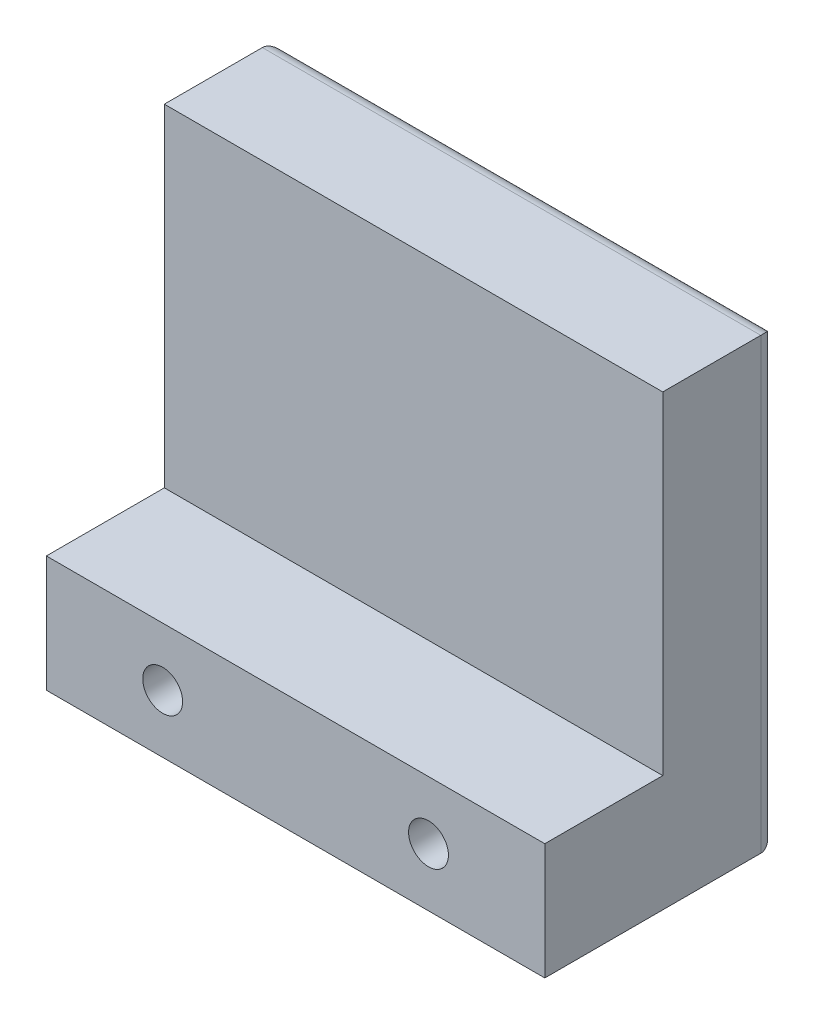
ISO-10303-21;
HEADER;
FILE_DESCRIPTION(('STEP AP214'),'2;1');
FILE_NAME('part.step','',(''),(''),'','','');
FILE_SCHEMA(('AUTOMOTIVE_DESIGN { 1 0 10303 214 1 1 1 1 }'));
ENDSEC;
DATA;
#1=APPLICATION_CONTEXT('core data for automotive mechanical design processes');
#2=APPLICATION_PROTOCOL_DEFINITION('international standard','automotive_design',2000,#1);
#3=PRODUCT_CONTEXT('',#1,'mechanical');
#4=PRODUCT('Part','Part','',(#3));
#5=PRODUCT_RELATED_PRODUCT_CATEGORY('part','',(#4));
#6=PRODUCT_DEFINITION_FORMATION('','',#4);
#7=PRODUCT_DEFINITION_CONTEXT('part definition',#1,'design');
#8=PRODUCT_DEFINITION('design','',#6,#7);
#9=PRODUCT_DEFINITION_SHAPE('','',#8);
#10=(LENGTH_UNIT() NAMED_UNIT(*) SI_UNIT(.MILLI.,.METRE.));
#11=(NAMED_UNIT(*) PLANE_ANGLE_UNIT() SI_UNIT($,.RADIAN.));
#12=(NAMED_UNIT(*) SI_UNIT($,.STERADIAN.) SOLID_ANGLE_UNIT());
#13=UNCERTAINTY_MEASURE_WITH_UNIT(LENGTH_MEASURE(1.E-05),#10,'distance_accuracy_value','');
#14=(GEOMETRIC_REPRESENTATION_CONTEXT(3) GLOBAL_UNCERTAINTY_ASSIGNED_CONTEXT((#13)) GLOBAL_UNIT_ASSIGNED_CONTEXT((#10,
#11,#12)) REPRESENTATION_CONTEXT('',''));
#15=CARTESIAN_POINT('',(0.,0.,0.));
#16=DIRECTION('',(0.,0.,1.));
#17=DIRECTION('',(1.,0.,0.));
#18=AXIS2_PLACEMENT_3D('',#15,#16,#17);
#19=CARTESIAN_POINT('',(-19.05,8.89,8.89));
#20=DIRECTION('',(1.,0.,0.));
#21=DIRECTION('',(0.,0.,-1.));
#22=AXIS2_PLACEMENT_3D('',#19,#20,#21);
#23=PLANE('',#22);
#24=DIRECTION('',(0.,0.,1.));
#25=VECTOR('',#24,1.);
#26=CARTESIAN_POINT('',(-19.05,34.29,-8.89));
#27=LINE('',#26,#25);
#28=CARTESIAN_POINT('',(-19.05,34.29,-7.61999999999999));
#29=VERTEX_POINT('',#28);
#30=CARTESIAN_POINT('',(-19.05,34.29,-0.126999999999997));
#31=VERTEX_POINT('',#30);
#32=EDGE_CURVE('E96',#29,#31,#27,.T.);
#33=ORIENTED_EDGE('',*,*,#32,.F.);
#34=DIRECTION('',(0.,-1.,0.));
#35=VECTOR('',#34,1.);
#36=CARTESIAN_POINT('',(-19.05,8.89,-7.61999999999999));
#37=LINE('',#36,#35);
#38=CARTESIAN_POINT('',(-19.05,0.,-7.61999999999999));
#39=VERTEX_POINT('',#38);
#40=EDGE_CURVE('E151',#29,#39,#37,.T.);
#41=ORIENTED_EDGE('',*,*,#40,.T.);
#42=DIRECTION('',(0.,0.,1.));
#43=VECTOR('',#42,1.);
#44=CARTESIAN_POINT('',(-19.05,0.,8.89));
#45=LINE('',#44,#43);
#46=CARTESIAN_POINT('',(-19.05,0.,8.89));
#47=VERTEX_POINT('',#46);
#48=EDGE_CURVE('E118',#39,#47,#45,.T.);
#49=ORIENTED_EDGE('',*,*,#48,.T.);
#50=DIRECTION('',(0.,-1.,0.));
#51=VECTOR('',#50,1.);
#52=CARTESIAN_POINT('',(-19.05,8.89,8.89));
#53=LINE('',#52,#51);
#54=CARTESIAN_POINT('',(-19.05,8.89,8.89));
#55=VERTEX_POINT('',#54);
#56=EDGE_CURVE('E136',#55,#47,#53,.T.);
#57=ORIENTED_EDGE('',*,*,#56,.F.);
#58=DIRECTION('',(0.,0.,1.));
#59=VECTOR('',#58,1.);
#60=CARTESIAN_POINT('',(-19.05,8.89,8.89));
#61=LINE('',#60,#59);
#62=CARTESIAN_POINT('',(-19.05,8.89,-0.126999999999997));
#63=VERTEX_POINT('',#62);
#64=EDGE_CURVE('E117',#63,#55,#61,.T.);
#65=ORIENTED_EDGE('',*,*,#64,.F.);
#66=DIRECTION('',(0.,-1.,0.));
#67=VECTOR('',#66,1.);
#68=CARTESIAN_POINT('',(-19.05,34.29,-0.126999999999997));
#69=LINE('',#68,#67);
#70=EDGE_CURVE('E110',#31,#63,#69,.T.);
#71=ORIENTED_EDGE('',*,*,#70,.F.);
#72=EDGE_LOOP('',(#33,#41,#49,#57,#65,#71));
#73=FACE_BOUND('',#72,.T.);
#74=ADVANCED_FACE('F33',(#73),#23,.F.);
#75=CARTESIAN_POINT('',(19.05,8.89,8.89));
#76=DIRECTION('',(0.,0.,-1.));
#77=DIRECTION('',(-1.,0.,0.));
#78=AXIS2_PLACEMENT_3D('',#75,#76,#77);
#79=PLANE('',#78);
#80=CARTESIAN_POINT('',(-10.16,4.445,8.89));
#81=DIRECTION('',(0.,0.,1.));
#82=DIRECTION('',(1.,0.,0.));
#83=AXIS2_PLACEMENT_3D('',#80,#81,#82);
#84=CIRCLE('',#83,1.524);
#85=CARTESIAN_POINT('',(-8.636,4.445,8.89));
#86=VERTEX_POINT('',#85);
#87=EDGE_CURVE('E173',#86,#86,#84,.T.);
#88=ORIENTED_EDGE('',*,*,#87,.F.);
#89=EDGE_LOOP('',(#88));
#90=FACE_BOUND('',#89,.T.);
#91=CARTESIAN_POINT('',(10.16,4.445,8.89));
#92=DIRECTION('',(0.,0.,1.));
#93=DIRECTION('',(1.,0.,0.));
#94=AXIS2_PLACEMENT_3D('',#91,#92,#93);
#95=CIRCLE('',#94,1.524);
#96=CARTESIAN_POINT('',(11.684,4.445,8.89));
#97=VERTEX_POINT('',#96);
#98=EDGE_CURVE('E163',#97,#97,#95,.T.);
#99=ORIENTED_EDGE('',*,*,#98,.F.);
#100=EDGE_LOOP('',(#99));
#101=FACE_BOUND('',#100,.T.);
#102=DIRECTION('',(1.,0.,0.));
#103=VECTOR('',#102,1.);
#104=CARTESIAN_POINT('',(19.05,0.,8.89));
#105=LINE('',#104,#103);
#106=CARTESIAN_POINT('',(19.05,0.,8.89));
#107=VERTEX_POINT('',#106);
#108=EDGE_CURVE('E120',#47,#107,#105,.T.);
#109=ORIENTED_EDGE('',*,*,#108,.T.);
#110=DIRECTION('',(0.,-1.,0.));
#111=VECTOR('',#110,1.);
#112=CARTESIAN_POINT('',(19.05,8.89,8.89));
#113=LINE('',#112,#111);
#114=CARTESIAN_POINT('',(19.05,8.89,8.89));
#115=VERTEX_POINT('',#114);
#116=EDGE_CURVE('E130',#115,#107,#113,.T.);
#117=ORIENTED_EDGE('',*,*,#116,.F.);
#118=DIRECTION('',(1.,0.,0.));
#119=VECTOR('',#118,1.);
#120=CARTESIAN_POINT('',(19.05,8.89,8.89));
#121=LINE('',#120,#119);
#122=EDGE_CURVE('E126',#55,#115,#121,.T.);
#123=ORIENTED_EDGE('',*,*,#122,.F.);
#124=ORIENTED_EDGE('',*,*,#56,.T.);
#125=EDGE_LOOP('',(#109,#117,#123,#124));
#126=FACE_BOUND('',#125,.T.);
#127=ADVANCED_FACE('F187',(#90,#101,#126),#79,.F.);
#128=CARTESIAN_POINT('',(19.05,8.89,8.89));
#129=DIRECTION('',(-1.,0.,0.));
#130=DIRECTION('',(0.,0.,1.));
#131=AXIS2_PLACEMENT_3D('',#128,#129,#130);
#132=PLANE('',#131);
#133=DIRECTION('',(0.,0.,-1.));
#134=VECTOR('',#133,1.);
#135=CARTESIAN_POINT('',(19.05,0.,8.89));
#136=LINE('',#135,#134);
#137=CARTESIAN_POINT('',(19.05,0.,-7.62));
#138=VERTEX_POINT('',#137);
#139=EDGE_CURVE('E127',#107,#138,#136,.T.);
#140=ORIENTED_EDGE('',*,*,#139,.T.);
#141=DIRECTION('',(0.,-1.,0.));
#142=VECTOR('',#141,1.);
#143=CARTESIAN_POINT('',(19.05,8.89,-7.62));
#144=LINE('',#143,#142);
#145=CARTESIAN_POINT('',(19.05,34.29,-7.62));
#146=VERTEX_POINT('',#145);
#147=EDGE_CURVE('E11',#138,#146,#144,.F.);
#148=ORIENTED_EDGE('',*,*,#147,.T.);
#149=DIRECTION('',(0.,0.,-1.));
#150=VECTOR('',#149,1.);
#151=CARTESIAN_POINT('',(19.05,34.29,-8.89));
#152=LINE('',#151,#150);
#153=CARTESIAN_POINT('',(19.05,34.29,-0.126999999999997));
#154=VERTEX_POINT('',#153);
#155=EDGE_CURVE('E113',#154,#146,#152,.T.);
#156=ORIENTED_EDGE('',*,*,#155,.F.);
#157=DIRECTION('',(0.,-1.,0.));
#158=VECTOR('',#157,1.);
#159=CARTESIAN_POINT('',(19.05,34.29,-0.126999999999997));
#160=LINE('',#159,#158);
#161=CARTESIAN_POINT('',(19.05,8.89,-0.126999999999997));
#162=VERTEX_POINT('',#161);
#163=EDGE_CURVE('E112',#154,#162,#160,.T.);
#164=ORIENTED_EDGE('',*,*,#163,.T.);
#165=DIRECTION('',(0.,0.,-1.));
#166=VECTOR('',#165,1.);
#167=CARTESIAN_POINT('',(19.05,8.89,8.89));
#168=LINE('',#167,#166);
#169=EDGE_CURVE('E129',#115,#162,#168,.T.);
#170=ORIENTED_EDGE('',*,*,#169,.F.);
#171=ORIENTED_EDGE('',*,*,#116,.T.);
#172=EDGE_LOOP('',(#140,#148,#156,#164,#170,#171));
#173=FACE_BOUND('',#172,.T.);
#174=ADVANCED_FACE('F190',(#173),#132,.F.);
#175=CARTESIAN_POINT('',(19.05,8.89,-8.89));
#176=DIRECTION('',(0.,0.,1.));
#177=DIRECTION('',(1.,0.,0.));
#178=AXIS2_PLACEMENT_3D('',#175,#176,#177);
#179=PLANE('',#178);
#180=DIRECTION('',(0.,-1.,0.));
#181=VECTOR('',#180,1.);
#182=CARTESIAN_POINT('',(17.78,8.89,-8.89));
#183=LINE('',#182,#181);
#184=CARTESIAN_POINT('',(17.78,33.02,-8.89));
#185=VERTEX_POINT('',#184);
#186=CARTESIAN_POINT('',(17.78,1.27,-8.89));
#187=VERTEX_POINT('',#186);
#188=EDGE_CURVE('E139',#185,#187,#183,.T.);
#189=ORIENTED_EDGE('',*,*,#188,.T.);
#190=DIRECTION('',(-1.,0.,0.));
#191=VECTOR('',#190,1.);
#192=CARTESIAN_POINT('',(19.05,1.27,-8.89));
#193=LINE('',#192,#191);
#194=CARTESIAN_POINT('',(-17.78,1.27,-8.89));
#195=VERTEX_POINT('',#194);
#196=EDGE_CURVE('E145',#187,#195,#193,.T.);
#197=ORIENTED_EDGE('',*,*,#196,.T.);
#198=DIRECTION('',(0.,-1.,0.));
#199=VECTOR('',#198,1.);
#200=CARTESIAN_POINT('',(-17.78,8.89,-8.89));
#201=LINE('',#200,#199);
#202=CARTESIAN_POINT('',(-17.78,33.02,-8.89));
#203=VERTEX_POINT('',#202);
#204=EDGE_CURVE('E143',#195,#203,#201,.F.);
#205=ORIENTED_EDGE('',*,*,#204,.T.);
#206=DIRECTION('',(-1.,0.,0.));
#207=VECTOR('',#206,1.);
#208=CARTESIAN_POINT('',(19.05,33.02,-8.89));
#209=LINE('',#208,#207);
#210=EDGE_CURVE('E141',#203,#185,#209,.F.);
#211=ORIENTED_EDGE('',*,*,#210,.T.);
#212=EDGE_LOOP('',(#189,#197,#205,#211));
#213=FACE_BOUND('',#212,.T.);
#214=CARTESIAN_POINT('',(-10.16,4.445,-8.89));
#215=DIRECTION('',(0.,0.,1.));
#216=DIRECTION('',(1.,0.,0.));
#217=AXIS2_PLACEMENT_3D('',#214,#215,#216);
#218=CIRCLE('',#217,1.524);
#219=CARTESIAN_POINT('',(-8.636,4.445,-8.89));
#220=VERTEX_POINT('',#219);
#221=EDGE_CURVE('E177',#220,#220,#218,.T.);
#222=ORIENTED_EDGE('',*,*,#221,.T.);
#223=EDGE_LOOP('',(#222));
#224=FACE_BOUND('',#223,.T.);
#225=CARTESIAN_POINT('',(10.16,4.445,-8.89));
#226=DIRECTION('',(0.,0.,1.));
#227=DIRECTION('',(1.,0.,0.));
#228=AXIS2_PLACEMENT_3D('',#225,#226,#227);
#229=CIRCLE('',#228,1.524);
#230=CARTESIAN_POINT('',(11.684,4.445,-8.89));
#231=VERTEX_POINT('',#230);
#232=EDGE_CURVE('E168',#231,#231,#229,.T.);
#233=ORIENTED_EDGE('',*,*,#232,.T.);
#234=EDGE_LOOP('',(#233));
#235=FACE_BOUND('',#234,.T.);
#236=ADVANCED_FACE('F210',(#213,#224,#235),#179,.F.);
#237=CARTESIAN_POINT('',(0.,8.89,0.));
#238=DIRECTION('',(0.,1.,0.));
#239=DIRECTION('',(0.,0.,1.));
#240=AXIS2_PLACEMENT_3D('',#237,#238,#239);
#241=PLANE('',#240);
#242=DIRECTION('',(1.,0.,0.));
#243=VECTOR('',#242,1.);
#244=CARTESIAN_POINT('',(-19.05,8.89,-0.126999999999997));
#245=LINE('',#244,#243);
#246=EDGE_CURVE('E104',#63,#162,#245,.T.);
#247=ORIENTED_EDGE('',*,*,#246,.F.);
#248=ORIENTED_EDGE('',*,*,#64,.T.);
#249=ORIENTED_EDGE('',*,*,#122,.T.);
#250=ORIENTED_EDGE('',*,*,#169,.T.);
#251=EDGE_LOOP('',(#247,#248,#249,#250));
#252=FACE_BOUND('',#251,.T.);
#253=ADVANCED_FACE('F266',(#252),#241,.T.);
#254=CARTESIAN_POINT('',(0.,0.,0.));
#255=DIRECTION('',(0.,1.,0.));
#256=DIRECTION('',(0.,0.,1.));
#257=AXIS2_PLACEMENT_3D('',#254,#255,#256);
#258=PLANE('',#257);
#259=ORIENTED_EDGE('',*,*,#48,.F.);
#260=DIRECTION('',(-1.,0.,0.));
#261=VECTOR('',#260,1.);
#262=CARTESIAN_POINT('',(0.,0.,-7.62));
#263=LINE('',#262,#261);
#264=EDGE_CURVE('E148',#39,#138,#263,.F.);
#265=ORIENTED_EDGE('',*,*,#264,.T.);
#266=ORIENTED_EDGE('',*,*,#139,.F.);
#267=ORIENTED_EDGE('',*,*,#108,.F.);
#268=EDGE_LOOP('',(#259,#265,#266,#267));
#269=FACE_BOUND('',#268,.T.);
#270=ADVANCED_FACE('F200',(#269),#258,.F.);
#271=CARTESIAN_POINT('',(-19.05,34.29,-0.126999999999997));
#272=DIRECTION('',(0.,0.,-1.));
#273=DIRECTION('',(-1.,0.,0.));
#274=AXIS2_PLACEMENT_3D('',#271,#272,#273);
#275=PLANE('',#274);
#276=ORIENTED_EDGE('',*,*,#246,.T.);
#277=ORIENTED_EDGE('',*,*,#163,.F.);
#278=DIRECTION('',(1.,0.,0.));
#279=VECTOR('',#278,1.);
#280=CARTESIAN_POINT('',(-19.05,34.29,-0.126999999999997));
#281=LINE('',#280,#279);
#282=EDGE_CURVE('E99',#31,#154,#281,.T.);
#283=ORIENTED_EDGE('',*,*,#282,.F.);
#284=ORIENTED_EDGE('',*,*,#70,.T.);
#285=EDGE_LOOP('',(#276,#277,#283,#284));
#286=FACE_BOUND('',#285,.T.);
#287=ADVANCED_FACE('F109',(#286),#275,.F.);
#288=CARTESIAN_POINT('',(0.,34.29,0.));
#289=DIRECTION('',(0.,1.,0.));
#290=DIRECTION('',(0.,0.,1.));
#291=AXIS2_PLACEMENT_3D('',#288,#289,#290);
#292=PLANE('',#291);
#293=ORIENTED_EDGE('',*,*,#155,.T.);
#294=DIRECTION('',(-1.,0.,0.));
#295=VECTOR('',#294,1.);
#296=CARTESIAN_POINT('',(-19.05,34.29,-7.61999999999999));
#297=LINE('',#296,#295);
#298=EDGE_CURVE('E42',#146,#29,#297,.T.);
#299=ORIENTED_EDGE('',*,*,#298,.T.);
#300=ORIENTED_EDGE('',*,*,#32,.T.);
#301=ORIENTED_EDGE('',*,*,#282,.T.);
#302=EDGE_LOOP('',(#293,#299,#300,#301));
#303=FACE_BOUND('',#302,.T.);
#304=ADVANCED_FACE('F98',(#303),#292,.T.);
#305=CARTESIAN_POINT('',(10.16,4.445,-8.89));
#306=DIRECTION('',(0.,0.,1.));
#307=DIRECTION('',(1.,0.,0.));
#308=AXIS2_PLACEMENT_3D('',#305,#306,#307);
#309=CYLINDRICAL_SURFACE('',#308,1.524);
#310=CARTESIAN_POINT('',(11.684,4.445,-8.89));
#311=CARTESIAN_POINT('',(11.684,4.445,-8.70479166666667));
#312=CARTESIAN_POINT('',(11.684,4.445,-8.51958333333334));
#313=CARTESIAN_POINT('',(11.684,4.445,-8.14916666666667));
#314=CARTESIAN_POINT('',(11.684,4.445,-7.96395833333334));
#315=CARTESIAN_POINT('',(11.684,4.445,-7.59354166666667));
#316=CARTESIAN_POINT('',(11.684,4.445,-7.40833333333334));
#317=CARTESIAN_POINT('',(11.684,4.445,-7.03791666666667));
#318=CARTESIAN_POINT('',(11.684,4.445,-6.85270833333334));
#319=CARTESIAN_POINT('',(11.684,4.445,-6.48229166666667));
#320=CARTESIAN_POINT('',(11.684,4.445,-6.29708333333334));
#321=CARTESIAN_POINT('',(11.684,4.445,-5.92666666666667));
#322=CARTESIAN_POINT('',(11.684,4.445,-5.74145833333334));
#323=CARTESIAN_POINT('',(11.684,4.445,-5.37104166666667));
#324=CARTESIAN_POINT('',(11.684,4.445,-5.18583333333334));
#325=CARTESIAN_POINT('',(11.684,4.445,-4.81541666666667));
#326=CARTESIAN_POINT('',(11.684,4.445,-4.63020833333334));
#327=CARTESIAN_POINT('',(11.684,4.445,-4.25979166666667));
#328=CARTESIAN_POINT('',(11.684,4.445,-4.07458333333334));
#329=CARTESIAN_POINT('',(11.684,4.445,-3.70416666666667));
#330=CARTESIAN_POINT('',(11.684,4.445,-3.51895833333334));
#331=CARTESIAN_POINT('',(11.684,4.445,-3.14854166666667));
#332=CARTESIAN_POINT('',(11.684,4.445,-2.96333333333334));
#333=CARTESIAN_POINT('',(11.684,4.445,-2.59291666666667));
#334=CARTESIAN_POINT('',(11.684,4.445,-2.40770833333334));
#335=CARTESIAN_POINT('',(11.684,4.445,-2.03729166666667));
#336=CARTESIAN_POINT('',(11.684,4.445,-1.85208333333334));
#337=CARTESIAN_POINT('',(11.684,4.445,-1.48166666666667));
#338=CARTESIAN_POINT('',(11.684,4.445,-1.29645833333334));
#339=CARTESIAN_POINT('',(11.684,4.445,-0.926041666666669));
#340=CARTESIAN_POINT('',(11.684,4.445,-0.740833333333337));
#341=CARTESIAN_POINT('',(11.684,4.445,-0.370416666666671));
#342=CARTESIAN_POINT('',(11.684,4.445,-0.185208333333337));
#343=CARTESIAN_POINT('',(11.684,4.445,0.18520833333333));
#344=CARTESIAN_POINT('',(11.684,4.445,0.370416666666664));
#345=CARTESIAN_POINT('',(11.684,4.445,0.740833333333331));
#346=CARTESIAN_POINT('',(11.684,4.445,0.926041666666664));
#347=CARTESIAN_POINT('',(11.684,4.445,1.29645833333333));
#348=CARTESIAN_POINT('',(11.684,4.445,1.48166666666666));
#349=CARTESIAN_POINT('',(11.684,4.445,1.85208333333333));
#350=CARTESIAN_POINT('',(11.684,4.445,2.03729166666666));
#351=CARTESIAN_POINT('',(11.684,4.445,2.40770833333333));
#352=CARTESIAN_POINT('',(11.684,4.445,2.59291666666666));
#353=CARTESIAN_POINT('',(11.684,4.445,2.96333333333333));
#354=CARTESIAN_POINT('',(11.684,4.445,3.14854166666666));
#355=CARTESIAN_POINT('',(11.684,4.445,3.51895833333333));
#356=CARTESIAN_POINT('',(11.684,4.445,3.70416666666666));
#357=CARTESIAN_POINT('',(11.684,4.445,4.07458333333333));
#358=CARTESIAN_POINT('',(11.684,4.445,4.25979166666666));
#359=CARTESIAN_POINT('',(11.684,4.445,4.63020833333333));
#360=CARTESIAN_POINT('',(11.684,4.445,4.81541666666666));
#361=CARTESIAN_POINT('',(11.684,4.445,5.18583333333333));
#362=CARTESIAN_POINT('',(11.684,4.445,5.37104166666667));
#363=CARTESIAN_POINT('',(11.684,4.445,5.74145833333333));
#364=CARTESIAN_POINT('',(11.684,4.445,5.92666666666666));
#365=CARTESIAN_POINT('',(11.684,4.445,6.29708333333333));
#366=CARTESIAN_POINT('',(11.684,4.445,6.48229166666667));
#367=CARTESIAN_POINT('',(11.684,4.445,6.85270833333333));
#368=CARTESIAN_POINT('',(11.684,4.445,7.03791666666666));
#369=CARTESIAN_POINT('',(11.684,4.445,7.40833333333333));
#370=CARTESIAN_POINT('',(11.684,4.445,7.59354166666666));
#371=CARTESIAN_POINT('',(11.684,4.445,7.96395833333333));
#372=CARTESIAN_POINT('',(11.684,4.445,8.14916666666666));
#373=CARTESIAN_POINT('',(11.684,4.445,8.51958333333333));
#374=CARTESIAN_POINT('',(11.684,4.445,8.70479166666667));
#375=CARTESIAN_POINT('',(11.684,4.445,8.89));
#376=B_SPLINE_CURVE_WITH_KNOTS('',3,(#310,#311,#312,#313,#314,#315,#316,#317,#318,#319,#320,
#321,#322,#323,#324,#325,#326,#327,#328,#329,#330,#331,#332,#333,#334,#335,#336,#337,#338,#339,
#340,#341,#342,#343,#344,#345,#346,#347,#348,#349,#350,#351,#352,#353,#354,#355,#356,#357,#358,
#359,#360,#361,#362,#363,#364,#365,#366,#367,#368,#369,#370,#371,#372,#373,#374,#375),
.UNSPECIFIED.,.F.,.F.,(4,2,2,2,2,2,2,2,2,2,2,2,2,2,2,2,2,2,2,2,2,2,2,2,2,2,2,2,2,2,2,2,4),(0.,
0.555625000000001,1.11125,1.666875,2.2225,2.778125,3.33375,3.889375,4.445,5.000625,5.55625,
6.111875,6.6675,7.223125,7.77875,8.334375,8.89,9.445625,10.00125,10.556875,11.1125,11.668125,
12.22375,12.779375,13.335,13.890625,14.44625,15.001875,15.5575,16.113125,16.66875,17.224375,
17.78),.UNSPECIFIED.);
#377=EDGE_CURVE('BSEAM253',#231,#97,#376,.T.);
#378=ORIENTED_EDGE('',*,*,#232,.F.);
#379=ORIENTED_EDGE('',*,*,#98,.T.);
#380=ORIENTED_EDGE('',*,*,#377,.T.);
#381=ORIENTED_EDGE('',*,*,#377,.F.);
#382=EDGE_LOOP('',(#378,#380,#379,#381));
#383=FACE_BOUND('',#382,.T.);
#384=ADVANCED_FACE('F253',(#383),#309,.F.);
#385=CARTESIAN_POINT('',(-10.16,4.445,-8.89));
#386=DIRECTION('',(0.,0.,1.));
#387=DIRECTION('',(1.,0.,0.));
#388=AXIS2_PLACEMENT_3D('',#385,#386,#387);
#389=CYLINDRICAL_SURFACE('',#388,1.524);
#390=CARTESIAN_POINT('',(-8.636,4.445,-8.89));
#391=CARTESIAN_POINT('',(-8.636,4.445,-8.70479166666667));
#392=CARTESIAN_POINT('',(-8.636,4.445,-8.51958333333334));
#393=CARTESIAN_POINT('',(-8.636,4.445,-8.14916666666667));
#394=CARTESIAN_POINT('',(-8.636,4.445,-7.96395833333334));
#395=CARTESIAN_POINT('',(-8.636,4.445,-7.59354166666667));
#396=CARTESIAN_POINT('',(-8.636,4.445,-7.40833333333334));
#397=CARTESIAN_POINT('',(-8.636,4.445,-7.03791666666667));
#398=CARTESIAN_POINT('',(-8.636,4.445,-6.85270833333334));
#399=CARTESIAN_POINT('',(-8.636,4.445,-6.48229166666667));
#400=CARTESIAN_POINT('',(-8.636,4.445,-6.29708333333334));
#401=CARTESIAN_POINT('',(-8.636,4.445,-5.92666666666667));
#402=CARTESIAN_POINT('',(-8.636,4.445,-5.74145833333334));
#403=CARTESIAN_POINT('',(-8.636,4.445,-5.37104166666667));
#404=CARTESIAN_POINT('',(-8.636,4.445,-5.18583333333334));
#405=CARTESIAN_POINT('',(-8.636,4.445,-4.81541666666667));
#406=CARTESIAN_POINT('',(-8.636,4.445,-4.63020833333334));
#407=CARTESIAN_POINT('',(-8.636,4.445,-4.25979166666667));
#408=CARTESIAN_POINT('',(-8.636,4.445,-4.07458333333334));
#409=CARTESIAN_POINT('',(-8.636,4.445,-3.70416666666667));
#410=CARTESIAN_POINT('',(-8.636,4.445,-3.51895833333334));
#411=CARTESIAN_POINT('',(-8.636,4.445,-3.14854166666667));
#412=CARTESIAN_POINT('',(-8.636,4.445,-2.96333333333334));
#413=CARTESIAN_POINT('',(-8.636,4.445,-2.59291666666667));
#414=CARTESIAN_POINT('',(-8.636,4.445,-2.40770833333334));
#415=CARTESIAN_POINT('',(-8.636,4.445,-2.03729166666667));
#416=CARTESIAN_POINT('',(-8.636,4.445,-1.85208333333334));
#417=CARTESIAN_POINT('',(-8.636,4.445,-1.48166666666667));
#418=CARTESIAN_POINT('',(-8.636,4.445,-1.29645833333334));
#419=CARTESIAN_POINT('',(-8.636,4.445,-0.926041666666669));
#420=CARTESIAN_POINT('',(-8.636,4.445,-0.740833333333337));
#421=CARTESIAN_POINT('',(-8.636,4.445,-0.370416666666671));
#422=CARTESIAN_POINT('',(-8.636,4.445,-0.185208333333337));
#423=CARTESIAN_POINT('',(-8.636,4.445,0.18520833333333));
#424=CARTESIAN_POINT('',(-8.636,4.445,0.370416666666664));
#425=CARTESIAN_POINT('',(-8.636,4.445,0.740833333333331));
#426=CARTESIAN_POINT('',(-8.636,4.445,0.926041666666664));
#427=CARTESIAN_POINT('',(-8.636,4.445,1.29645833333333));
#428=CARTESIAN_POINT('',(-8.636,4.445,1.48166666666666));
#429=CARTESIAN_POINT('',(-8.636,4.445,1.85208333333333));
#430=CARTESIAN_POINT('',(-8.636,4.445,2.03729166666666));
#431=CARTESIAN_POINT('',(-8.636,4.445,2.40770833333333));
#432=CARTESIAN_POINT('',(-8.636,4.445,2.59291666666666));
#433=CARTESIAN_POINT('',(-8.636,4.445,2.96333333333333));
#434=CARTESIAN_POINT('',(-8.636,4.445,3.14854166666666));
#435=CARTESIAN_POINT('',(-8.636,4.445,3.51895833333333));
#436=CARTESIAN_POINT('',(-8.636,4.445,3.70416666666666));
#437=CARTESIAN_POINT('',(-8.636,4.445,4.07458333333333));
#438=CARTESIAN_POINT('',(-8.636,4.445,4.25979166666666));
#439=CARTESIAN_POINT('',(-8.636,4.445,4.63020833333333));
#440=CARTESIAN_POINT('',(-8.636,4.445,4.81541666666666));
#441=CARTESIAN_POINT('',(-8.636,4.445,5.18583333333333));
#442=CARTESIAN_POINT('',(-8.636,4.445,5.37104166666667));
#443=CARTESIAN_POINT('',(-8.636,4.445,5.74145833333333));
#444=CARTESIAN_POINT('',(-8.636,4.445,5.92666666666666));
#445=CARTESIAN_POINT('',(-8.636,4.445,6.29708333333333));
#446=CARTESIAN_POINT('',(-8.636,4.445,6.48229166666667));
#447=CARTESIAN_POINT('',(-8.636,4.445,6.85270833333333));
#448=CARTESIAN_POINT('',(-8.636,4.445,7.03791666666666));
#449=CARTESIAN_POINT('',(-8.636,4.445,7.40833333333333));
#450=CARTESIAN_POINT('',(-8.636,4.445,7.59354166666666));
#451=CARTESIAN_POINT('',(-8.636,4.445,7.96395833333333));
#452=CARTESIAN_POINT('',(-8.636,4.445,8.14916666666666));
#453=CARTESIAN_POINT('',(-8.636,4.445,8.51958333333333));
#454=CARTESIAN_POINT('',(-8.636,4.445,8.70479166666667));
#455=CARTESIAN_POINT('',(-8.636,4.445,8.89));
#456=B_SPLINE_CURVE_WITH_KNOTS('',3,(#390,#391,#392,#393,#394,#395,#396,#397,#398,#399,#400,
#401,#402,#403,#404,#405,#406,#407,#408,#409,#410,#411,#412,#413,#414,#415,#416,#417,#418,#419,
#420,#421,#422,#423,#424,#425,#426,#427,#428,#429,#430,#431,#432,#433,#434,#435,#436,#437,#438,
#439,#440,#441,#442,#443,#444,#445,#446,#447,#448,#449,#450,#451,#452,#453,#454,#455),
.UNSPECIFIED.,.F.,.F.,(4,2,2,2,2,2,2,2,2,2,2,2,2,2,2,2,2,2,2,2,2,2,2,2,2,2,2,2,2,2,2,2,4),(0.,
0.555625000000001,1.11125,1.666875,2.2225,2.778125,3.33375,3.889375,4.445,5.000625,5.55625,
6.111875,6.6675,7.223125,7.77875,8.334375,8.89,9.445625,10.00125,10.556875,11.1125,11.668125,
12.22375,12.779375,13.335,13.890625,14.44625,15.001875,15.5575,16.113125,16.66875,17.224375,
17.78),.UNSPECIFIED.);
#457=EDGE_CURVE('BSEAM185',#220,#86,#456,.T.);
#458=ORIENTED_EDGE('',*,*,#221,.F.);
#459=ORIENTED_EDGE('',*,*,#87,.T.);
#460=ORIENTED_EDGE('',*,*,#457,.T.);
#461=ORIENTED_EDGE('',*,*,#457,.F.);
#462=EDGE_LOOP('',(#458,#460,#459,#461));
#463=FACE_BOUND('',#462,.T.);
#464=ADVANCED_FACE('F185',(#463),#389,.F.);
#465=CARTESIAN_POINT('',(0.,33.02,-7.62));
#466=DIRECTION('',(1.,0.,0.));
#467=DIRECTION('',(0.,0.,-1.));
#468=AXIS2_PLACEMENT_3D('',#465,#466,#467);
#469=CYLINDRICAL_SURFACE('',#468,1.27);
#470=CARTESIAN_POINT('',(-17.78,33.02,-7.61999999999999));
#471=DIRECTION('',(0.707106781186547,0.707106781186547,0.));
#472=DIRECTION('',(0.707106781186547,-0.707106781186547,0.));
#473=AXIS2_PLACEMENT_3D('',#470,#471,#472);
#474=ELLIPSE('',#473,1.79605122421383,1.27);
#475=EDGE_CURVE('E157',#29,#203,#474,.F.);
#476=ORIENTED_EDGE('',*,*,#475,.F.);
#477=ORIENTED_EDGE('',*,*,#298,.F.);
#478=CARTESIAN_POINT('',(17.78,33.02,-7.62));
#479=DIRECTION('',(0.707106781186547,-0.707106781186547,0.));
#480=DIRECTION('',(-0.707106781186547,-0.707106781186547,0.));
#481=AXIS2_PLACEMENT_3D('',#478,#479,#480);
#482=ELLIPSE('',#481,1.79605122421383,1.27);
#483=EDGE_CURVE('E37',#185,#146,#482,.T.);
#484=ORIENTED_EDGE('',*,*,#483,.F.);
#485=ORIENTED_EDGE('',*,*,#210,.F.);
#486=EDGE_LOOP('',(#476,#477,#484,#485));
#487=FACE_BOUND('',#486,.T.);
#488=ADVANCED_FACE('F35',(#487),#469,.T.);
#489=CARTESIAN_POINT('',(17.78,8.89,-7.62));
#490=DIRECTION('',(0.,-1.,0.));
#491=DIRECTION('',(0.,0.,-1.));
#492=AXIS2_PLACEMENT_3D('',#489,#490,#491);
#493=CYLINDRICAL_SURFACE('',#492,1.27);
#494=ORIENTED_EDGE('',*,*,#483,.T.);
#495=ORIENTED_EDGE('',*,*,#147,.F.);
#496=CARTESIAN_POINT('',(17.78,1.27,-7.62));
#497=DIRECTION('',(-0.707106781186547,-0.707106781186547,0.));
#498=DIRECTION('',(0.707106781186547,-0.707106781186547,0.));
#499=AXIS2_PLACEMENT_3D('',#496,#497,#498);
#500=ELLIPSE('',#499,1.79605122421383,1.27);
#501=EDGE_CURVE('E156',#187,#138,#500,.T.);
#502=ORIENTED_EDGE('',*,*,#501,.F.);
#503=ORIENTED_EDGE('',*,*,#188,.F.);
#504=EDGE_LOOP('',(#494,#495,#502,#503));
#505=FACE_BOUND('',#504,.T.);
#506=ADVANCED_FACE('F211',(#505),#493,.T.);
#507=CARTESIAN_POINT('',(-17.78,8.89,-7.61999999999999));
#508=DIRECTION('',(0.,-1.,0.));
#509=DIRECTION('',(0.,0.,-1.));
#510=AXIS2_PLACEMENT_3D('',#507,#508,#509);
#511=CYLINDRICAL_SURFACE('',#510,1.27);
#512=ORIENTED_EDGE('',*,*,#475,.T.);
#513=ORIENTED_EDGE('',*,*,#204,.F.);
#514=CARTESIAN_POINT('',(-17.78,1.27,-7.61999999999999));
#515=DIRECTION('',(0.707106781186547,-0.707106781186547,0.));
#516=DIRECTION('',(-0.707106781186547,-0.707106781186547,0.));
#517=AXIS2_PLACEMENT_3D('',#514,#515,#516);
#518=ELLIPSE('',#517,1.79605122421383,1.27);
#519=EDGE_CURVE('E154',#39,#195,#518,.T.);
#520=ORIENTED_EDGE('',*,*,#519,.F.);
#521=ORIENTED_EDGE('',*,*,#40,.F.);
#522=EDGE_LOOP('',(#512,#513,#520,#521));
#523=FACE_BOUND('',#522,.T.);
#524=ADVANCED_FACE('F207',(#523),#511,.T.);
#525=CARTESIAN_POINT('',(19.05,1.27,-7.62));
#526=DIRECTION('',(-1.,0.,0.));
#527=DIRECTION('',(0.,0.,1.));
#528=AXIS2_PLACEMENT_3D('',#525,#526,#527);
#529=CYLINDRICAL_SURFACE('',#528,1.27);
#530=ORIENTED_EDGE('',*,*,#501,.T.);
#531=ORIENTED_EDGE('',*,*,#264,.F.);
#532=ORIENTED_EDGE('',*,*,#519,.T.);
#533=ORIENTED_EDGE('',*,*,#196,.F.);
#534=EDGE_LOOP('',(#530,#531,#532,#533));
#535=FACE_BOUND('',#534,.T.);
#536=ADVANCED_FACE('F204',(#535),#529,.T.);
#537=CLOSED_SHELL('',(#74,#127,#174,#236,#253,#270,#287,#304,#384,#464,#488,#506,#524,#536));
#538=MANIFOLD_SOLID_BREP('B2',#537);
#539=ADVANCED_BREP_SHAPE_REPRESENTATION('',(#18,#538),#14);
#540=SHAPE_DEFINITION_REPRESENTATION(#9,#539);
ENDSEC;
END-ISO-10303-21;
